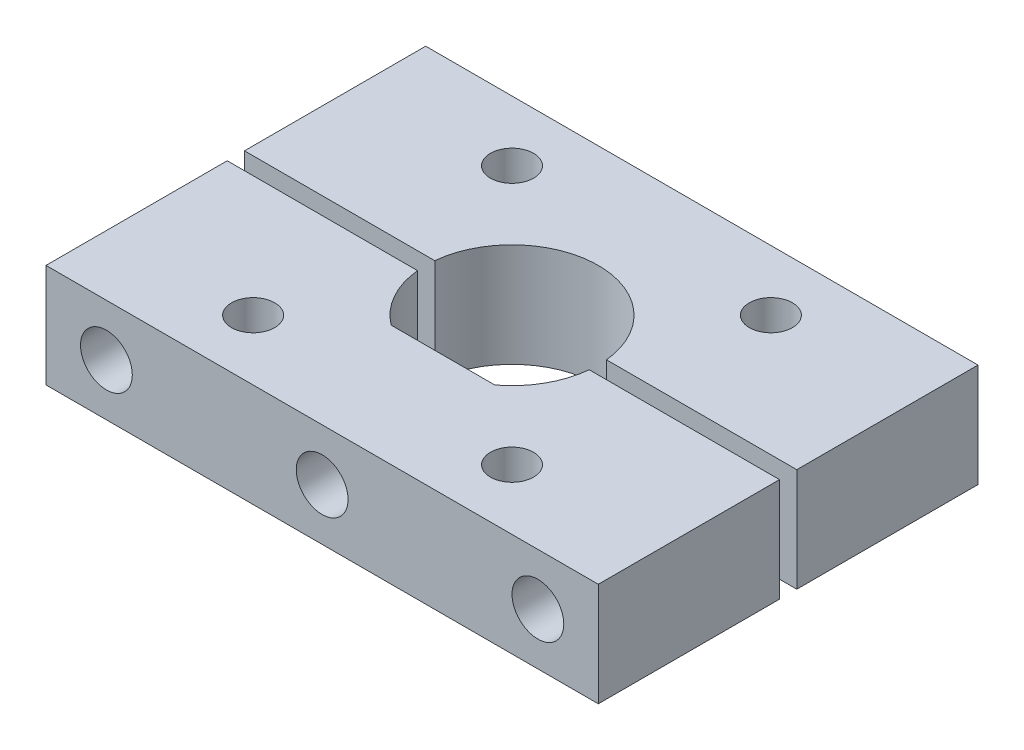
ISO-10303-21;
HEADER;
FILE_DESCRIPTION(('STEP AP214'),'2;1');
FILE_NAME('part.step','',(''),(''),'','','');
FILE_SCHEMA(('AUTOMOTIVE_DESIGN { 1 0 10303 214 1 1 1 1 }'));
ENDSEC;
DATA;
#1=APPLICATION_CONTEXT('core data for automotive mechanical design processes');
#2=APPLICATION_PROTOCOL_DEFINITION('international standard','automotive_design',2000,#1);
#3=PRODUCT_CONTEXT('',#1,'mechanical');
#4=PRODUCT('Part','Part','',(#3));
#5=PRODUCT_RELATED_PRODUCT_CATEGORY('part','',(#4));
#6=PRODUCT_DEFINITION_FORMATION('','',#4);
#7=PRODUCT_DEFINITION_CONTEXT('part definition',#1,'design');
#8=PRODUCT_DEFINITION('design','',#6,#7);
#9=PRODUCT_DEFINITION_SHAPE('','',#8);
#10=(LENGTH_UNIT() NAMED_UNIT(*) SI_UNIT(.MILLI.,.METRE.));
#11=(NAMED_UNIT(*) PLANE_ANGLE_UNIT() SI_UNIT($,.RADIAN.));
#12=(NAMED_UNIT(*) SI_UNIT($,.STERADIAN.) SOLID_ANGLE_UNIT());
#13=UNCERTAINTY_MEASURE_WITH_UNIT(LENGTH_MEASURE(1.E-05),#10,'distance_accuracy_value','');
#14=(GEOMETRIC_REPRESENTATION_CONTEXT(3) GLOBAL_UNCERTAINTY_ASSIGNED_CONTEXT((#13)) GLOBAL_UNIT_ASSIGNED_CONTEXT((#10,
#11,#12)) REPRESENTATION_CONTEXT('',''));
#15=CARTESIAN_POINT('',(0.,0.,0.));
#16=DIRECTION('',(0.,0.,1.));
#17=DIRECTION('',(1.,0.,0.));
#18=AXIS2_PLACEMENT_3D('',#15,#16,#17);
#19=CARTESIAN_POINT('',(-16.,3.,0.499999999999999));
#20=DIRECTION('',(1.,0.,0.));
#21=DIRECTION('',(0.,0.,-1.));
#22=AXIS2_PLACEMENT_3D('',#19,#20,#21);
#23=PLANE('',#22);
#24=DIRECTION('',(0.,0.,1.));
#25=VECTOR('',#24,1.);
#26=CARTESIAN_POINT('',(-16.,-3.,0.499999999999999));
#27=LINE('',#26,#25);
#28=CARTESIAN_POINT('',(-16.,-3.,0.499999999999999));
#29=VERTEX_POINT('',#28);
#30=CARTESIAN_POINT('',(-16.,-3.,11.));
#31=VERTEX_POINT('',#30);
#32=EDGE_CURVE('E162',#29,#31,#27,.T.);
#33=ORIENTED_EDGE('',*,*,#32,.T.);
#34=DIRECTION('',(0.,-1.,0.));
#35=VECTOR('',#34,1.);
#36=CARTESIAN_POINT('',(-16.,3.,11.));
#37=LINE('',#36,#35);
#38=CARTESIAN_POINT('',(-16.,3.,11.));
#39=VERTEX_POINT('',#38);
#40=EDGE_CURVE('E14',#39,#31,#37,.T.);
#41=ORIENTED_EDGE('',*,*,#40,.F.);
#42=DIRECTION('',(0.,0.,1.));
#43=VECTOR('',#42,1.);
#44=CARTESIAN_POINT('',(-16.,3.,0.499999999999999));
#45=LINE('',#44,#43);
#46=CARTESIAN_POINT('',(-16.,3.,0.499999999999999));
#47=VERTEX_POINT('',#46);
#48=EDGE_CURVE('E177',#47,#39,#45,.T.);
#49=ORIENTED_EDGE('',*,*,#48,.F.);
#50=DIRECTION('',(0.,-1.,0.));
#51=VECTOR('',#50,1.);
#52=CARTESIAN_POINT('',(-16.,3.,0.499999999999999));
#53=LINE('',#52,#51);
#54=EDGE_CURVE('E158',#47,#29,#53,.T.);
#55=ORIENTED_EDGE('',*,*,#54,.T.);
#56=EDGE_LOOP('',(#33,#41,#49,#55));
#57=FACE_BOUND('',#56,.T.);
#58=ADVANCED_FACE('F64',(#57),#23,.F.);
#59=CARTESIAN_POINT('',(-16.,3.,11.));
#60=DIRECTION('',(0.,0.,-1.));
#61=DIRECTION('',(-1.,0.,0.));
#62=AXIS2_PLACEMENT_3D('',#59,#60,#61);
#63=PLANE('',#62);
#64=CARTESIAN_POINT('',(12.5,0.,11.));
#65=DIRECTION('',(0.,0.,1.));
#66=DIRECTION('',(1.,0.,0.));
#67=AXIS2_PLACEMENT_3D('',#64,#65,#66);
#68=CIRCLE('',#67,1.5);
#69=CARTESIAN_POINT('',(14.,0.,11.));
#70=VERTEX_POINT('',#69);
#71=EDGE_CURVE('E378',#70,#70,#68,.T.);
#72=ORIENTED_EDGE('',*,*,#71,.F.);
#73=EDGE_LOOP('',(#72));
#74=FACE_BOUND('',#73,.T.);
#75=CARTESIAN_POINT('',(-12.5,0.,11.));
#76=DIRECTION('',(0.,0.,1.));
#77=DIRECTION('',(1.,0.,0.));
#78=AXIS2_PLACEMENT_3D('',#75,#76,#77);
#79=CIRCLE('',#78,1.5);
#80=CARTESIAN_POINT('',(-11.,0.,11.));
#81=VERTEX_POINT('',#80);
#82=EDGE_CURVE('E379',#81,#81,#79,.T.);
#83=ORIENTED_EDGE('',*,*,#82,.F.);
#84=EDGE_LOOP('',(#83));
#85=FACE_BOUND('',#84,.T.);
#86=CARTESIAN_POINT('',(0.,0.,11.));
#87=DIRECTION('',(0.,0.,1.));
#88=DIRECTION('',(1.,0.,0.));
#89=AXIS2_PLACEMENT_3D('',#86,#87,#88);
#90=CIRCLE('',#89,1.5);
#91=CARTESIAN_POINT('',(1.5,0.,11.));
#92=VERTEX_POINT('',#91);
#93=EDGE_CURVE('E192',#92,#92,#90,.T.);
#94=ORIENTED_EDGE('',*,*,#93,.F.);
#95=EDGE_LOOP('',(#94));
#96=FACE_BOUND('',#95,.T.);
#97=DIRECTION('',(1.,0.,0.));
#98=VECTOR('',#97,1.);
#99=CARTESIAN_POINT('',(-16.,-3.,11.));
#100=LINE('',#99,#98);
#101=CARTESIAN_POINT('',(16.,-3.,11.));
#102=VERTEX_POINT('',#101);
#103=EDGE_CURVE('E165',#31,#102,#100,.T.);
#104=ORIENTED_EDGE('',*,*,#103,.T.);
#105=DIRECTION('',(0.,-1.,0.));
#106=VECTOR('',#105,1.);
#107=CARTESIAN_POINT('',(16.,3.,11.));
#108=LINE('',#107,#106);
#109=CARTESIAN_POINT('',(16.,3.,11.));
#110=VERTEX_POINT('',#109);
#111=EDGE_CURVE('E73',#110,#102,#108,.T.);
#112=ORIENTED_EDGE('',*,*,#111,.F.);
#113=DIRECTION('',(1.,0.,0.));
#114=VECTOR('',#113,1.);
#115=CARTESIAN_POINT('',(-16.,3.,11.));
#116=LINE('',#115,#114);
#117=EDGE_CURVE('E125',#39,#110,#116,.T.);
#118=ORIENTED_EDGE('',*,*,#117,.F.);
#119=ORIENTED_EDGE('',*,*,#40,.T.);
#120=EDGE_LOOP('',(#104,#112,#118,#119));
#121=FACE_BOUND('',#120,.T.);
#122=ADVANCED_FACE('F250',(#74,#85,#96,#121),#63,.F.);
#123=CARTESIAN_POINT('',(16.,3.,0.499999999999999));
#124=DIRECTION('',(-1.,0.,0.));
#125=DIRECTION('',(0.,0.,1.));
#126=AXIS2_PLACEMENT_3D('',#123,#124,#125);
#127=PLANE('',#126);
#128=DIRECTION('',(0.,0.,-1.));
#129=VECTOR('',#128,1.);
#130=CARTESIAN_POINT('',(16.,-3.,0.499999999999999));
#131=LINE('',#130,#129);
#132=CARTESIAN_POINT('',(16.,-3.,0.499999999999999));
#133=VERTEX_POINT('',#132);
#134=EDGE_CURVE('E168',#102,#133,#131,.T.);
#135=ORIENTED_EDGE('',*,*,#134,.T.);
#136=DIRECTION('',(0.,-1.,0.));
#137=VECTOR('',#136,1.);
#138=CARTESIAN_POINT('',(16.,3.,0.499999999999999));
#139=LINE('',#138,#137);
#140=CARTESIAN_POINT('',(16.,3.,0.499999999999999));
#141=VERTEX_POINT('',#140);
#142=EDGE_CURVE('E184',#141,#133,#139,.T.);
#143=ORIENTED_EDGE('',*,*,#142,.F.);
#144=DIRECTION('',(0.,0.,-1.));
#145=VECTOR('',#144,1.);
#146=CARTESIAN_POINT('',(16.,3.,0.499999999999999));
#147=LINE('',#146,#145);
#148=EDGE_CURVE('E217',#110,#141,#147,.T.);
#149=ORIENTED_EDGE('',*,*,#148,.F.);
#150=ORIENTED_EDGE('',*,*,#111,.T.);
#151=EDGE_LOOP('',(#135,#143,#149,#150));
#152=FACE_BOUND('',#151,.T.);
#153=ADVANCED_FACE('F254',(#152),#127,.F.);
#154=CARTESIAN_POINT('',(16.,3.,0.499999999999999));
#155=DIRECTION('',(0.,0.,1.));
#156=DIRECTION('',(1.,0.,0.));
#157=AXIS2_PLACEMENT_3D('',#154,#155,#156);
#158=PLANE('',#157);
#159=CARTESIAN_POINT('',(12.5,0.,0.499999999999999));
#160=DIRECTION('',(0.,0.,1.));
#161=DIRECTION('',(1.,0.,0.));
#162=AXIS2_PLACEMENT_3D('',#159,#160,#161);
#163=CIRCLE('',#162,1.5);
#164=CARTESIAN_POINT('',(14.,0.,0.499999999999999));
#165=VERTEX_POINT('',#164);
#166=EDGE_CURVE('E67',#165,#165,#163,.T.);
#167=ORIENTED_EDGE('',*,*,#166,.T.);
#168=EDGE_LOOP('',(#167));
#169=FACE_BOUND('',#168,.T.);
#170=DIRECTION('',(-1.,0.,0.));
#171=VECTOR('',#170,1.);
#172=CARTESIAN_POINT('',(16.,-3.,0.499999999999999));
#173=LINE('',#172,#171);
#174=CARTESIAN_POINT('',(4.9749371855331,-3.,0.5));
#175=VERTEX_POINT('',#174);
#176=EDGE_CURVE('E170',#133,#175,#173,.T.);
#177=ORIENTED_EDGE('',*,*,#176,.T.);
#178=DIRECTION('',(0.,-1.,0.));
#179=VECTOR('',#178,1.);
#180=CARTESIAN_POINT('',(4.9749371855331,3.,0.5));
#181=LINE('',#180,#179);
#182=CARTESIAN_POINT('',(4.9749371855331,3.,0.5));
#183=VERTEX_POINT('',#182);
#184=EDGE_CURVE('E181',#183,#175,#181,.T.);
#185=ORIENTED_EDGE('',*,*,#184,.F.);
#186=DIRECTION('',(-1.,0.,0.));
#187=VECTOR('',#186,1.);
#188=CARTESIAN_POINT('',(16.,3.,0.499999999999999));
#189=LINE('',#188,#187);
#190=EDGE_CURVE('E219',#141,#183,#189,.T.);
#191=ORIENTED_EDGE('',*,*,#190,.F.);
#192=ORIENTED_EDGE('',*,*,#142,.T.);
#193=EDGE_LOOP('',(#177,#185,#191,#192));
#194=FACE_BOUND('',#193,.T.);
#195=ADVANCED_FACE('F225',(#169,#194),#158,.F.);
#196=CARTESIAN_POINT('',(0.,3.,0.));
#197=DIRECTION('',(0.,-1.,0.));
#198=DIRECTION('',(0.,0.,-1.));
#199=AXIS2_PLACEMENT_3D('',#196,#197,#198);
#200=CYLINDRICAL_SURFACE('',#199,5.);
#201=CARTESIAN_POINT('',(0.,-3.,0.));
#202=DIRECTION('',(0.,-1.,0.));
#203=DIRECTION('',(0.,0.,-1.));
#204=AXIS2_PLACEMENT_3D('',#201,#202,#203);
#205=CIRCLE('',#204,5.);
#206=CARTESIAN_POINT('',(3.,-3.,4.));
#207=VERTEX_POINT('',#206);
#208=EDGE_CURVE('E172',#175,#207,#205,.T.);
#209=ORIENTED_EDGE('',*,*,#208,.T.);
#210=DIRECTION('',(0.,-1.,0.));
#211=VECTOR('',#210,1.);
#212=CARTESIAN_POINT('',(3.,3.,4.));
#213=LINE('',#212,#211);
#214=CARTESIAN_POINT('',(3.,3.,4.));
#215=VERTEX_POINT('',#214);
#216=EDGE_CURVE('E153',#215,#207,#213,.T.);
#217=ORIENTED_EDGE('',*,*,#216,.F.);
#218=CARTESIAN_POINT('',(0.,3.,0.));
#219=DIRECTION('',(0.,-1.,0.));
#220=DIRECTION('',(0.,0.,-1.));
#221=AXIS2_PLACEMENT_3D('',#218,#219,#220);
#222=CIRCLE('',#221,5.);
#223=EDGE_CURVE('E144',#183,#215,#222,.T.);
#224=ORIENTED_EDGE('',*,*,#223,.F.);
#225=ORIENTED_EDGE('',*,*,#184,.T.);
#226=EDGE_LOOP('',(#209,#217,#224,#225));
#227=FACE_BOUND('',#226,.T.);
#228=ADVANCED_FACE('F229',(#227),#200,.F.);
#229=CARTESIAN_POINT('',(-3.,3.,4.));
#230=DIRECTION('',(0.,0.,1.));
#231=DIRECTION('',(1.,0.,0.));
#232=AXIS2_PLACEMENT_3D('',#229,#230,#231);
#233=PLANE('',#232);
#234=CARTESIAN_POINT('',(0.,0.,4.));
#235=DIRECTION('',(0.,0.,1.));
#236=DIRECTION('',(1.,0.,0.));
#237=AXIS2_PLACEMENT_3D('',#234,#235,#236);
#238=CIRCLE('',#237,1.5);
#239=CARTESIAN_POINT('',(1.5,0.,4.));
#240=VERTEX_POINT('',#239);
#241=EDGE_CURVE('E191',#240,#240,#238,.T.);
#242=ORIENTED_EDGE('',*,*,#241,.T.);
#243=EDGE_LOOP('',(#242));
#244=FACE_BOUND('',#243,.T.);
#245=DIRECTION('',(-1.,0.,0.));
#246=VECTOR('',#245,1.);
#247=CARTESIAN_POINT('',(-3.,-3.,4.));
#248=LINE('',#247,#246);
#249=CARTESIAN_POINT('',(-3.,-3.,4.));
#250=VERTEX_POINT('',#249);
#251=EDGE_CURVE('E152',#207,#250,#248,.T.);
#252=ORIENTED_EDGE('',*,*,#251,.T.);
#253=DIRECTION('',(0.,-1.,0.));
#254=VECTOR('',#253,1.);
#255=CARTESIAN_POINT('',(-3.,3.,4.));
#256=LINE('',#255,#254);
#257=CARTESIAN_POINT('',(-3.,3.,4.));
#258=VERTEX_POINT('',#257);
#259=EDGE_CURVE('E149',#258,#250,#256,.T.);
#260=ORIENTED_EDGE('',*,*,#259,.F.);
#261=DIRECTION('',(-1.,0.,0.));
#262=VECTOR('',#261,1.);
#263=CARTESIAN_POINT('',(-3.,3.,4.));
#264=LINE('',#263,#262);
#265=EDGE_CURVE('E138',#215,#258,#264,.T.);
#266=ORIENTED_EDGE('',*,*,#265,.F.);
#267=ORIENTED_EDGE('',*,*,#216,.T.);
#268=EDGE_LOOP('',(#252,#260,#266,#267));
#269=FACE_BOUND('',#268,.T.);
#270=ADVANCED_FACE('F150',(#244,#269),#233,.F.);
#271=CARTESIAN_POINT('',(0.,3.,0.));
#272=DIRECTION('',(0.,-1.,0.));
#273=DIRECTION('',(0.,0.,-1.));
#274=AXIS2_PLACEMENT_3D('',#271,#272,#273);
#275=CYLINDRICAL_SURFACE('',#274,5.);
#276=CARTESIAN_POINT('',(0.,-3.,0.));
#277=DIRECTION('',(0.,-1.,0.));
#278=DIRECTION('',(0.,0.,1.));
#279=AXIS2_PLACEMENT_3D('',#276,#277,#278);
#280=CIRCLE('',#279,5.);
#281=CARTESIAN_POINT('',(-4.9749371855331,-3.,0.499999999999999));
#282=VERTEX_POINT('',#281);
#283=EDGE_CURVE('E111',#250,#282,#280,.T.);
#284=ORIENTED_EDGE('',*,*,#283,.T.);
#285=DIRECTION('',(0.,-1.,0.));
#286=VECTOR('',#285,1.);
#287=CARTESIAN_POINT('',(-4.9749371855331,3.,0.499999999999999));
#288=LINE('',#287,#286);
#289=CARTESIAN_POINT('',(-4.9749371855331,3.,0.499999999999999));
#290=VERTEX_POINT('',#289);
#291=EDGE_CURVE('E154',#290,#282,#288,.T.);
#292=ORIENTED_EDGE('',*,*,#291,.F.);
#293=CARTESIAN_POINT('',(0.,3.,0.));
#294=DIRECTION('',(0.,-1.,0.));
#295=DIRECTION('',(0.,0.,1.));
#296=AXIS2_PLACEMENT_3D('',#293,#294,#295);
#297=CIRCLE('',#296,5.);
#298=EDGE_CURVE('E142',#258,#290,#297,.T.);
#299=ORIENTED_EDGE('',*,*,#298,.F.);
#300=ORIENTED_EDGE('',*,*,#259,.T.);
#301=EDGE_LOOP('',(#284,#292,#299,#300));
#302=FACE_BOUND('',#301,.T.);
#303=ADVANCED_FACE('F156',(#302),#275,.F.);
#304=CARTESIAN_POINT('',(-16.,3.,0.499999999999999));
#305=DIRECTION('',(0.,0.,1.));
#306=DIRECTION('',(1.,0.,0.));
#307=AXIS2_PLACEMENT_3D('',#304,#305,#306);
#308=PLANE('',#307);
#309=CARTESIAN_POINT('',(-12.5,0.,0.499999999999999));
#310=DIRECTION('',(0.,0.,1.));
#311=DIRECTION('',(1.,0.,0.));
#312=AXIS2_PLACEMENT_3D('',#309,#310,#311);
#313=CIRCLE('',#312,1.5);
#314=CARTESIAN_POINT('',(-11.,0.,0.499999999999999));
#315=VERTEX_POINT('',#314);
#316=EDGE_CURVE('E189',#315,#315,#313,.T.);
#317=ORIENTED_EDGE('',*,*,#316,.T.);
#318=EDGE_LOOP('',(#317));
#319=FACE_BOUND('',#318,.T.);
#320=DIRECTION('',(-1.,0.,0.));
#321=VECTOR('',#320,1.);
#322=CARTESIAN_POINT('',(-16.,-3.,0.499999999999999));
#323=LINE('',#322,#321);
#324=EDGE_CURVE('E117',#282,#29,#323,.T.);
#325=ORIENTED_EDGE('',*,*,#324,.T.);
#326=ORIENTED_EDGE('',*,*,#54,.F.);
#327=DIRECTION('',(-1.,0.,0.));
#328=VECTOR('',#327,1.);
#329=CARTESIAN_POINT('',(-16.,3.,0.499999999999999));
#330=LINE('',#329,#328);
#331=EDGE_CURVE('E82',#290,#47,#330,.T.);
#332=ORIENTED_EDGE('',*,*,#331,.F.);
#333=ORIENTED_EDGE('',*,*,#291,.T.);
#334=EDGE_LOOP('',(#325,#326,#332,#333));
#335=FACE_BOUND('',#334,.T.);
#336=ADVANCED_FACE('F237',(#319,#335),#308,.F.);
#337=CARTESIAN_POINT('',(0.,3.,0.));
#338=DIRECTION('',(0.,-1.,0.));
#339=DIRECTION('',(0.,0.,-1.));
#340=AXIS2_PLACEMENT_3D('',#337,#338,#339);
#341=PLANE('',#340);
#342=CARTESIAN_POINT('',(-7.5,3.,7.5));
#343=DIRECTION('',(0.,1.,0.));
#344=DIRECTION('',(0.,0.,1.));
#345=AXIS2_PLACEMENT_3D('',#342,#343,#344);
#346=CIRCLE('',#345,1.24999999999999);
#347=CARTESIAN_POINT('',(-7.5,3.,8.74999999999999));
#348=VERTEX_POINT('',#347);
#349=EDGE_CURVE('E197',#348,#348,#346,.T.);
#350=ORIENTED_EDGE('',*,*,#349,.F.);
#351=EDGE_LOOP('',(#350));
#352=FACE_BOUND('',#351,.T.);
#353=CARTESIAN_POINT('',(7.5,3.,7.5));
#354=DIRECTION('',(0.,1.,0.));
#355=DIRECTION('',(0.,0.,1.));
#356=AXIS2_PLACEMENT_3D('',#353,#354,#355);
#357=CIRCLE('',#356,1.24999999999999);
#358=CARTESIAN_POINT('',(7.5,3.,8.74999999999999));
#359=VERTEX_POINT('',#358);
#360=EDGE_CURVE('E206',#359,#359,#357,.T.);
#361=ORIENTED_EDGE('',*,*,#360,.F.);
#362=EDGE_LOOP('',(#361));
#363=FACE_BOUND('',#362,.T.);
#364=ORIENTED_EDGE('',*,*,#48,.T.);
#365=ORIENTED_EDGE('',*,*,#117,.T.);
#366=ORIENTED_EDGE('',*,*,#148,.T.);
#367=ORIENTED_EDGE('',*,*,#190,.T.);
#368=ORIENTED_EDGE('',*,*,#223,.T.);
#369=ORIENTED_EDGE('',*,*,#265,.T.);
#370=ORIENTED_EDGE('',*,*,#298,.T.);
#371=ORIENTED_EDGE('',*,*,#331,.T.);
#372=EDGE_LOOP('',(#364,#365,#366,#367,#368,#369,#370,#371));
#373=FACE_BOUND('',#372,.T.);
#374=ADVANCED_FACE('F140',(#352,#363,#373),#341,.F.);
#375=CARTESIAN_POINT('',(0.,-3.,0.));
#376=DIRECTION('',(0.,-1.,0.));
#377=DIRECTION('',(0.,0.,-1.));
#378=AXIS2_PLACEMENT_3D('',#375,#376,#377);
#379=PLANE('',#378);
#380=CARTESIAN_POINT('',(-7.5,-3.,7.5));
#381=DIRECTION('',(0.,1.,0.));
#382=DIRECTION('',(0.,0.,1.));
#383=AXIS2_PLACEMENT_3D('',#380,#381,#382);
#384=CIRCLE('',#383,1.25);
#385=CARTESIAN_POINT('',(-7.5,-3.,8.75));
#386=VERTEX_POINT('',#385);
#387=EDGE_CURVE('E201',#386,#386,#384,.T.);
#388=ORIENTED_EDGE('',*,*,#387,.T.);
#389=EDGE_LOOP('',(#388));
#390=FACE_BOUND('',#389,.T.);
#391=CARTESIAN_POINT('',(7.5,-3.,7.5));
#392=DIRECTION('',(0.,1.,0.));
#393=DIRECTION('',(0.,0.,1.));
#394=AXIS2_PLACEMENT_3D('',#391,#392,#393);
#395=CIRCLE('',#394,1.25);
#396=CARTESIAN_POINT('',(7.5,-3.,8.75));
#397=VERTEX_POINT('',#396);
#398=EDGE_CURVE('E166',#397,#397,#395,.T.);
#399=ORIENTED_EDGE('',*,*,#398,.T.);
#400=EDGE_LOOP('',(#399));
#401=FACE_BOUND('',#400,.T.);
#402=ORIENTED_EDGE('',*,*,#32,.F.);
#403=ORIENTED_EDGE('',*,*,#324,.F.);
#404=ORIENTED_EDGE('',*,*,#283,.F.);
#405=ORIENTED_EDGE('',*,*,#251,.F.);
#406=ORIENTED_EDGE('',*,*,#208,.F.);
#407=ORIENTED_EDGE('',*,*,#176,.F.);
#408=ORIENTED_EDGE('',*,*,#134,.F.);
#409=ORIENTED_EDGE('',*,*,#103,.F.);
#410=EDGE_LOOP('',(#402,#403,#404,#405,#406,#407,#408,#409));
#411=FACE_BOUND('',#410,.T.);
#412=ADVANCED_FACE('F232',(#390,#401,#411),#379,.T.);
#413=CARTESIAN_POINT('',(7.5,3.,7.5));
#414=DIRECTION('',(0.,1.,0.));
#415=DIRECTION('',(0.,0.,1.));
#416=AXIS2_PLACEMENT_3D('',#413,#414,#415);
#417=CYLINDRICAL_SURFACE('',#416,1.24999999999999);
#418=ORIENTED_EDGE('',*,*,#398,.F.);
#419=EDGE_LOOP('',(#418));
#420=FACE_BOUND('',#419,.T.);
#421=ORIENTED_EDGE('',*,*,#360,.T.);
#422=EDGE_LOOP('',(#421));
#423=FACE_BOUND('',#422,.T.);
#424=ADVANCED_FACE('F297',(#420,#423),#417,.F.);
#425=CARTESIAN_POINT('',(-7.5,3.,7.5));
#426=DIRECTION('',(0.,1.,0.));
#427=DIRECTION('',(0.,0.,1.));
#428=AXIS2_PLACEMENT_3D('',#425,#426,#427);
#429=CYLINDRICAL_SURFACE('',#428,1.24999999999999);
#430=ORIENTED_EDGE('',*,*,#387,.F.);
#431=EDGE_LOOP('',(#430));
#432=FACE_BOUND('',#431,.T.);
#433=ORIENTED_EDGE('',*,*,#349,.T.);
#434=EDGE_LOOP('',(#433));
#435=FACE_BOUND('',#434,.T.);
#436=ADVANCED_FACE('F307',(#432,#435),#429,.F.);
#437=CARTESIAN_POINT('',(-12.5,0.,-11.));
#438=DIRECTION('',(0.,0.,1.));
#439=DIRECTION('',(1.,0.,0.));
#440=AXIS2_PLACEMENT_3D('',#437,#438,#439);
#441=CYLINDRICAL_SURFACE('',#440,1.5);
#442=ORIENTED_EDGE('',*,*,#82,.T.);
#443=EDGE_LOOP('',(#442));
#444=FACE_BOUND('',#443,.T.);
#445=ORIENTED_EDGE('',*,*,#316,.F.);
#446=EDGE_LOOP('',(#445));
#447=FACE_BOUND('',#446,.T.);
#448=ADVANCED_FACE('F317',(#444,#447),#441,.F.);
#449=CARTESIAN_POINT('',(0.,0.,-11.));
#450=DIRECTION('',(0.,0.,1.));
#451=DIRECTION('',(1.,0.,0.));
#452=AXIS2_PLACEMENT_3D('',#449,#450,#451);
#453=CYLINDRICAL_SURFACE('',#452,1.5);
#454=ORIENTED_EDGE('',*,*,#93,.T.);
#455=EDGE_LOOP('',(#454));
#456=FACE_BOUND('',#455,.T.);
#457=ORIENTED_EDGE('',*,*,#241,.F.);
#458=EDGE_LOOP('',(#457));
#459=FACE_BOUND('',#458,.T.);
#460=ADVANCED_FACE('F352',(#456,#459),#453,.F.);
#461=CARTESIAN_POINT('',(12.5,0.,-11.));
#462=DIRECTION('',(0.,0.,1.));
#463=DIRECTION('',(1.,0.,0.));
#464=AXIS2_PLACEMENT_3D('',#461,#462,#463);
#465=CYLINDRICAL_SURFACE('',#464,1.5);
#466=ORIENTED_EDGE('',*,*,#71,.T.);
#467=EDGE_LOOP('',(#466));
#468=FACE_BOUND('',#467,.T.);
#469=ORIENTED_EDGE('',*,*,#166,.F.);
#470=EDGE_LOOP('',(#469));
#471=FACE_BOUND('',#470,.T.);
#472=ADVANCED_FACE('F359',(#468,#471),#465,.F.);
#473=CLOSED_SHELL('',(#58,#122,#153,#195,#228,#270,#303,#336,#374,#412,#424,#436,#448,#460,#472));
#474=MANIFOLD_SOLID_BREP('B2',#473);
#475=CARTESIAN_POINT('',(-16.,3.,-11.));
#476=DIRECTION('',(1.,0.,0.));
#477=DIRECTION('',(0.,0.,-1.));
#478=AXIS2_PLACEMENT_3D('',#475,#476,#477);
#479=PLANE('',#478);
#480=DIRECTION('',(0.,0.,1.));
#481=VECTOR('',#480,1.);
#482=CARTESIAN_POINT('',(-16.,-3.,-11.));
#483=LINE('',#482,#481);
#484=CARTESIAN_POINT('',(-16.,-3.,-11.));
#485=VERTEX_POINT('',#484);
#486=CARTESIAN_POINT('',(-16.,-3.,-0.499999999999999));
#487=VERTEX_POINT('',#486);
#488=EDGE_CURVE('E495',#485,#487,#483,.T.);
#489=ORIENTED_EDGE('',*,*,#488,.T.);
#490=DIRECTION('',(0.,-1.,0.));
#491=VECTOR('',#490,1.);
#492=CARTESIAN_POINT('',(-16.,3.,-0.499999999999999));
#493=LINE('',#492,#491);
#494=CARTESIAN_POINT('',(-16.,3.,-0.499999999999999));
#495=VERTEX_POINT('',#494);
#496=EDGE_CURVE('E62',#495,#487,#493,.T.);
#497=ORIENTED_EDGE('',*,*,#496,.F.);
#498=DIRECTION('',(0.,0.,1.));
#499=VECTOR('',#498,1.);
#500=CARTESIAN_POINT('',(-16.,3.,-11.));
#501=LINE('',#500,#499);
#502=CARTESIAN_POINT('',(-16.,3.,-11.));
#503=VERTEX_POINT('',#502);
#504=EDGE_CURVE('E512',#503,#495,#501,.T.);
#505=ORIENTED_EDGE('',*,*,#504,.F.);
#506=DIRECTION('',(0.,-1.,0.));
#507=VECTOR('',#506,1.);
#508=CARTESIAN_POINT('',(-16.,3.,-11.));
#509=LINE('',#508,#507);
#510=EDGE_CURVE('E491',#503,#485,#509,.T.);
#511=ORIENTED_EDGE('',*,*,#510,.T.);
#512=EDGE_LOOP('',(#489,#497,#505,#511));
#513=FACE_BOUND('',#512,.T.);
#514=ADVANCED_FACE('F406',(#513),#479,.F.);
#515=CARTESIAN_POINT('',(-4.9749371855331,3.,-0.5));
#516=DIRECTION('',(0.,0.,-1.));
#517=DIRECTION('',(-1.,0.,0.));
#518=AXIS2_PLACEMENT_3D('',#515,#516,#517);
#519=PLANE('',#518);
#520=CARTESIAN_POINT('',(-12.5,0.,-0.5));
#521=DIRECTION('',(0.,0.,-1.));
#522=DIRECTION('',(-1.,0.,0.));
#523=AXIS2_PLACEMENT_3D('',#520,#521,#522);
#524=CIRCLE('',#523,1.24999999999999);
#525=CARTESIAN_POINT('',(-13.75,0.,-0.5));
#526=VERTEX_POINT('',#525);
#527=EDGE_CURVE('E567',#526,#526,#524,.T.);
#528=ORIENTED_EDGE('',*,*,#527,.T.);
#529=EDGE_LOOP('',(#528));
#530=FACE_BOUND('',#529,.T.);
#531=DIRECTION('',(1.,0.,0.));
#532=VECTOR('',#531,1.);
#533=CARTESIAN_POINT('',(-4.9749371855331,-3.,-0.5));
#534=LINE('',#533,#532);
#535=CARTESIAN_POINT('',(-4.9749371855331,-3.,-0.500000000000001));
#536=VERTEX_POINT('',#535);
#537=EDGE_CURVE('E499',#487,#536,#534,.T.);
#538=ORIENTED_EDGE('',*,*,#537,.T.);
#539=DIRECTION('',(0.,-1.,0.));
#540=VECTOR('',#539,1.);
#541=CARTESIAN_POINT('',(-4.9749371855331,3.,-0.500000000000001));
#542=LINE('',#541,#540);
#543=CARTESIAN_POINT('',(-4.9749371855331,3.,-0.500000000000001));
#544=VERTEX_POINT('',#543);
#545=EDGE_CURVE('E415',#544,#536,#542,.T.);
#546=ORIENTED_EDGE('',*,*,#545,.F.);
#547=DIRECTION('',(1.,0.,0.));
#548=VECTOR('',#547,1.);
#549=CARTESIAN_POINT('',(-4.9749371855331,3.,-0.5));
#550=LINE('',#549,#548);
#551=EDGE_CURVE('E460',#495,#544,#550,.T.);
#552=ORIENTED_EDGE('',*,*,#551,.F.);
#553=ORIENTED_EDGE('',*,*,#496,.T.);
#554=EDGE_LOOP('',(#538,#546,#552,#553));
#555=FACE_BOUND('',#554,.T.);
#556=ADVANCED_FACE('F544',(#530,#555),#519,.F.);
#557=CARTESIAN_POINT('',(0.,3.,0.));
#558=DIRECTION('',(0.,-1.,0.));
#559=DIRECTION('',(0.,0.,-1.));
#560=AXIS2_PLACEMENT_3D('',#557,#558,#559);
#561=CYLINDRICAL_SURFACE('',#560,5.);
#562=CARTESIAN_POINT('',(0.,-3.,0.));
#563=DIRECTION('',(0.,-1.,0.));
#564=DIRECTION('',(0.,0.,1.));
#565=AXIS2_PLACEMENT_3D('',#562,#563,#564);
#566=CIRCLE('',#565,5.);
#567=CARTESIAN_POINT('',(4.9749371855331,-3.,-0.5));
#568=VERTEX_POINT('',#567);
#569=EDGE_CURVE('E503',#536,#568,#566,.T.);
#570=ORIENTED_EDGE('',*,*,#569,.T.);
#571=DIRECTION('',(0.,-1.,0.));
#572=VECTOR('',#571,1.);
#573=CARTESIAN_POINT('',(4.9749371855331,3.,-0.5));
#574=LINE('',#573,#572);
#575=CARTESIAN_POINT('',(4.9749371855331,3.,-0.5));
#576=VERTEX_POINT('',#575);
#577=EDGE_CURVE('E484',#576,#568,#574,.T.);
#578=ORIENTED_EDGE('',*,*,#577,.F.);
#579=CARTESIAN_POINT('',(0.,3.,0.));
#580=DIRECTION('',(0.,-1.,0.));
#581=DIRECTION('',(0.,0.,1.));
#582=AXIS2_PLACEMENT_3D('',#579,#580,#581);
#583=CIRCLE('',#582,5.);
#584=EDGE_CURVE('E473',#544,#576,#583,.T.);
#585=ORIENTED_EDGE('',*,*,#584,.F.);
#586=ORIENTED_EDGE('',*,*,#545,.T.);
#587=EDGE_LOOP('',(#570,#578,#585,#586));
#588=FACE_BOUND('',#587,.T.);
#589=ADVANCED_FACE('F522',(#588),#561,.F.);
#590=CARTESIAN_POINT('',(4.9749371855331,3.,-0.5));
#591=DIRECTION('',(0.,0.,-1.));
#592=DIRECTION('',(-1.,0.,0.));
#593=AXIS2_PLACEMENT_3D('',#590,#591,#592);
#594=PLANE('',#593);
#595=CARTESIAN_POINT('',(12.5,0.,-0.5));
#596=DIRECTION('',(0.,0.,-1.));
#597=DIRECTION('',(-1.,0.,0.));
#598=AXIS2_PLACEMENT_3D('',#595,#596,#597);
#599=CIRCLE('',#598,1.24999999999999);
#600=CARTESIAN_POINT('',(11.25,0.,-0.500000000000001));
#601=VERTEX_POINT('',#600);
#602=EDGE_CURVE('E500',#601,#601,#599,.T.);
#603=ORIENTED_EDGE('',*,*,#602,.T.);
#604=EDGE_LOOP('',(#603));
#605=FACE_BOUND('',#604,.T.);
#606=DIRECTION('',(1.,0.,0.));
#607=VECTOR('',#606,1.);
#608=CARTESIAN_POINT('',(4.9749371855331,-3.,-0.5));
#609=LINE('',#608,#607);
#610=CARTESIAN_POINT('',(16.,-3.,-0.499999999999999));
#611=VERTEX_POINT('',#610);
#612=EDGE_CURVE('E482',#568,#611,#609,.T.);
#613=ORIENTED_EDGE('',*,*,#612,.T.);
#614=DIRECTION('',(0.,-1.,0.));
#615=VECTOR('',#614,1.);
#616=CARTESIAN_POINT('',(16.,3.,-0.499999999999999));
#617=LINE('',#616,#615);
#618=CARTESIAN_POINT('',(16.,3.,-0.499999999999999));
#619=VERTEX_POINT('',#618);
#620=EDGE_CURVE('E479',#619,#611,#617,.T.);
#621=ORIENTED_EDGE('',*,*,#620,.F.);
#622=DIRECTION('',(1.,0.,0.));
#623=VECTOR('',#622,1.);
#624=CARTESIAN_POINT('',(4.9749371855331,3.,-0.5));
#625=LINE('',#624,#623);
#626=EDGE_CURVE('E467',#576,#619,#625,.T.);
#627=ORIENTED_EDGE('',*,*,#626,.F.);
#628=ORIENTED_EDGE('',*,*,#577,.T.);
#629=EDGE_LOOP('',(#613,#621,#627,#628));
#630=FACE_BOUND('',#629,.T.);
#631=ADVANCED_FACE('F480',(#605,#630),#594,.F.);
#632=CARTESIAN_POINT('',(16.,3.,-11.));
#633=DIRECTION('',(-1.,0.,0.));
#634=DIRECTION('',(0.,0.,1.));
#635=AXIS2_PLACEMENT_3D('',#632,#633,#634);
#636=PLANE('',#635);
#637=DIRECTION('',(0.,0.,-1.));
#638=VECTOR('',#637,1.);
#639=CARTESIAN_POINT('',(16.,-3.,-11.));
#640=LINE('',#639,#638);
#641=CARTESIAN_POINT('',(16.,-3.,-11.));
#642=VERTEX_POINT('',#641);
#643=EDGE_CURVE('E446',#611,#642,#640,.T.);
#644=ORIENTED_EDGE('',*,*,#643,.T.);
#645=DIRECTION('',(0.,-1.,0.));
#646=VECTOR('',#645,1.);
#647=CARTESIAN_POINT('',(16.,3.,-11.));
#648=LINE('',#647,#646);
#649=CARTESIAN_POINT('',(16.,3.,-11.));
#650=VERTEX_POINT('',#649);
#651=EDGE_CURVE('E485',#650,#642,#648,.T.);
#652=ORIENTED_EDGE('',*,*,#651,.F.);
#653=DIRECTION('',(0.,0.,-1.));
#654=VECTOR('',#653,1.);
#655=CARTESIAN_POINT('',(16.,3.,-11.));
#656=LINE('',#655,#654);
#657=EDGE_CURVE('E471',#619,#650,#656,.T.);
#658=ORIENTED_EDGE('',*,*,#657,.F.);
#659=ORIENTED_EDGE('',*,*,#620,.T.);
#660=EDGE_LOOP('',(#644,#652,#658,#659));
#661=FACE_BOUND('',#660,.T.);
#662=ADVANCED_FACE('F487',(#661),#636,.F.);
#663=CARTESIAN_POINT('',(-16.,3.,-11.));
#664=DIRECTION('',(0.,0.,1.));
#665=DIRECTION('',(1.,0.,0.));
#666=AXIS2_PLACEMENT_3D('',#663,#664,#665);
#667=PLANE('',#666);
#668=CARTESIAN_POINT('',(-12.5,0.,-11.));
#669=DIRECTION('',(0.,0.,1.));
#670=DIRECTION('',(1.,0.,0.));
#671=AXIS2_PLACEMENT_3D('',#668,#669,#670);
#672=CIRCLE('',#671,1.25);
#673=CARTESIAN_POINT('',(-11.25,0.,-11.));
#674=VERTEX_POINT('',#673);
#675=EDGE_CURVE('E577',#674,#674,#672,.T.);
#676=ORIENTED_EDGE('',*,*,#675,.T.);
#677=EDGE_LOOP('',(#676));
#678=FACE_BOUND('',#677,.T.);
#679=CARTESIAN_POINT('',(12.5,0.,-11.));
#680=DIRECTION('',(0.,0.,1.));
#681=DIRECTION('',(1.,0.,0.));
#682=AXIS2_PLACEMENT_3D('',#679,#680,#681);
#683=CIRCLE('',#682,1.25);
#684=CARTESIAN_POINT('',(13.75,0.,-11.));
#685=VERTEX_POINT('',#684);
#686=EDGE_CURVE('E563',#685,#685,#683,.T.);
#687=ORIENTED_EDGE('',*,*,#686,.T.);
#688=EDGE_LOOP('',(#687));
#689=FACE_BOUND('',#688,.T.);
#690=DIRECTION('',(-1.,0.,0.));
#691=VECTOR('',#690,1.);
#692=CARTESIAN_POINT('',(-16.,-3.,-11.));
#693=LINE('',#692,#691);
#694=EDGE_CURVE('E452',#642,#485,#693,.T.);
#695=ORIENTED_EDGE('',*,*,#694,.T.);
#696=ORIENTED_EDGE('',*,*,#510,.F.);
#697=DIRECTION('',(-1.,0.,0.));
#698=VECTOR('',#697,1.);
#699=CARTESIAN_POINT('',(-16.,3.,-11.));
#700=LINE('',#699,#698);
#701=EDGE_CURVE('E423',#650,#503,#700,.T.);
#702=ORIENTED_EDGE('',*,*,#701,.F.);
#703=ORIENTED_EDGE('',*,*,#651,.T.);
#704=EDGE_LOOP('',(#695,#696,#702,#703));
#705=FACE_BOUND('',#704,.T.);
#706=ADVANCED_FACE('F529',(#678,#689,#705),#667,.F.);
#707=CARTESIAN_POINT('',(0.,3.,0.));
#708=DIRECTION('',(0.,1.,0.));
#709=DIRECTION('',(0.,0.,1.));
#710=AXIS2_PLACEMENT_3D('',#707,#708,#709);
#711=PLANE('',#710);
#712=CARTESIAN_POINT('',(-7.5,3.,-7.5));
#713=DIRECTION('',(0.,1.,0.));
#714=DIRECTION('',(0.,0.,1.));
#715=AXIS2_PLACEMENT_3D('',#712,#713,#714);
#716=CIRCLE('',#715,1.24999999999999);
#717=CARTESIAN_POINT('',(-7.5,3.,-6.25000000000001));
#718=VERTEX_POINT('',#717);
#719=EDGE_CURVE('E592',#718,#718,#716,.T.);
#720=ORIENTED_EDGE('',*,*,#719,.F.);
#721=EDGE_LOOP('',(#720));
#722=FACE_BOUND('',#721,.T.);
#723=CARTESIAN_POINT('',(7.5,3.,-7.5));
#724=DIRECTION('',(0.,1.,0.));
#725=DIRECTION('',(0.,0.,1.));
#726=AXIS2_PLACEMENT_3D('',#723,#724,#725);
#727=CIRCLE('',#726,1.24999999999999);
#728=CARTESIAN_POINT('',(7.5,3.,-6.25000000000001));
#729=VERTEX_POINT('',#728);
#730=EDGE_CURVE('E584',#729,#729,#727,.T.);
#731=ORIENTED_EDGE('',*,*,#730,.F.);
#732=EDGE_LOOP('',(#731));
#733=FACE_BOUND('',#732,.T.);
#734=ORIENTED_EDGE('',*,*,#504,.T.);
#735=ORIENTED_EDGE('',*,*,#551,.T.);
#736=ORIENTED_EDGE('',*,*,#584,.T.);
#737=ORIENTED_EDGE('',*,*,#626,.T.);
#738=ORIENTED_EDGE('',*,*,#657,.T.);
#739=ORIENTED_EDGE('',*,*,#701,.T.);
#740=EDGE_LOOP('',(#734,#735,#736,#737,#738,#739));
#741=FACE_BOUND('',#740,.T.);
#742=ADVANCED_FACE('F469',(#722,#733,#741),#711,.T.);
#743=CARTESIAN_POINT('',(0.,-3.,0.));
#744=DIRECTION('',(0.,1.,0.));
#745=DIRECTION('',(0.,0.,1.));
#746=AXIS2_PLACEMENT_3D('',#743,#744,#745);
#747=PLANE('',#746);
#748=CARTESIAN_POINT('',(-7.5,-3.,-7.5));
#749=DIRECTION('',(0.,1.,0.));
#750=DIRECTION('',(0.,0.,1.));
#751=AXIS2_PLACEMENT_3D('',#748,#749,#750);
#752=CIRCLE('',#751,1.25);
#753=CARTESIAN_POINT('',(-7.5,-3.,-6.25));
#754=VERTEX_POINT('',#753);
#755=EDGE_CURVE('E588',#754,#754,#752,.T.);
#756=ORIENTED_EDGE('',*,*,#755,.T.);
#757=EDGE_LOOP('',(#756));
#758=FACE_BOUND('',#757,.T.);
#759=CARTESIAN_POINT('',(7.5,-3.,-7.5));
#760=DIRECTION('',(0.,1.,0.));
#761=DIRECTION('',(0.,0.,1.));
#762=AXIS2_PLACEMENT_3D('',#759,#760,#761);
#763=CIRCLE('',#762,1.25);
#764=CARTESIAN_POINT('',(7.5,-3.,-6.25));
#765=VERTEX_POINT('',#764);
#766=EDGE_CURVE('E580',#765,#765,#763,.T.);
#767=ORIENTED_EDGE('',*,*,#766,.T.);
#768=EDGE_LOOP('',(#767));
#769=FACE_BOUND('',#768,.T.);
#770=ORIENTED_EDGE('',*,*,#488,.F.);
#771=ORIENTED_EDGE('',*,*,#694,.F.);
#772=ORIENTED_EDGE('',*,*,#643,.F.);
#773=ORIENTED_EDGE('',*,*,#612,.F.);
#774=ORIENTED_EDGE('',*,*,#569,.F.);
#775=ORIENTED_EDGE('',*,*,#537,.F.);
#776=EDGE_LOOP('',(#770,#771,#772,#773,#774,#775));
#777=FACE_BOUND('',#776,.T.);
#778=ADVANCED_FACE('F525',(#758,#769,#777),#747,.F.);
#779=CARTESIAN_POINT('',(12.5,0.,11.));
#780=DIRECTION('',(0.,0.,1.));
#781=DIRECTION('',(1.,0.,0.));
#782=AXIS2_PLACEMENT_3D('',#779,#780,#781);
#783=CYLINDRICAL_SURFACE('',#782,1.24999999999999);
#784=ORIENTED_EDGE('',*,*,#686,.F.);
#785=EDGE_LOOP('',(#784));
#786=FACE_BOUND('',#785,.T.);
#787=ORIENTED_EDGE('',*,*,#602,.F.);
#788=EDGE_LOOP('',(#787));
#789=FACE_BOUND('',#788,.T.);
#790=ADVANCED_FACE('F612',(#786,#789),#783,.F.);
#791=CARTESIAN_POINT('',(-12.5,0.,11.));
#792=DIRECTION('',(0.,0.,1.));
#793=DIRECTION('',(1.,0.,0.));
#794=AXIS2_PLACEMENT_3D('',#791,#792,#793);
#795=CYLINDRICAL_SURFACE('',#794,1.24999999999999);
#796=ORIENTED_EDGE('',*,*,#675,.F.);
#797=EDGE_LOOP('',(#796));
#798=FACE_BOUND('',#797,.T.);
#799=ORIENTED_EDGE('',*,*,#527,.F.);
#800=EDGE_LOOP('',(#799));
#801=FACE_BOUND('',#800,.T.);
#802=ADVANCED_FACE('F603',(#798,#801),#795,.F.);
#803=CARTESIAN_POINT('',(7.5,3.,-7.5));
#804=DIRECTION('',(0.,1.,0.));
#805=DIRECTION('',(0.,0.,1.));
#806=AXIS2_PLACEMENT_3D('',#803,#804,#805);
#807=CYLINDRICAL_SURFACE('',#806,1.24999999999999);
#808=ORIENTED_EDGE('',*,*,#766,.F.);
#809=EDGE_LOOP('',(#808));
#810=FACE_BOUND('',#809,.T.);
#811=ORIENTED_EDGE('',*,*,#730,.T.);
#812=EDGE_LOOP('',(#811));
#813=FACE_BOUND('',#812,.T.);
#814=ADVANCED_FACE('F601',(#810,#813),#807,.F.);
#815=CARTESIAN_POINT('',(-7.5,3.,-7.5));
#816=DIRECTION('',(0.,1.,0.));
#817=DIRECTION('',(0.,0.,1.));
#818=AXIS2_PLACEMENT_3D('',#815,#816,#817);
#819=CYLINDRICAL_SURFACE('',#818,1.24999999999999);
#820=ORIENTED_EDGE('',*,*,#755,.F.);
#821=EDGE_LOOP('',(#820));
#822=FACE_BOUND('',#821,.T.);
#823=ORIENTED_EDGE('',*,*,#719,.T.);
#824=EDGE_LOOP('',(#823));
#825=FACE_BOUND('',#824,.T.);
#826=ADVANCED_FACE('F597',(#822,#825),#819,.F.);
#827=CLOSED_SHELL('',(#514,#556,#589,#631,#662,#706,#742,#778,#790,#802,#814,#826));
#828=MANIFOLD_SOLID_BREP('B8',#827);
#829=ADVANCED_BREP_SHAPE_REPRESENTATION('',(#18,#474,#828),#14);
#830=SHAPE_DEFINITION_REPRESENTATION(#9,#829);
ENDSEC;
END-ISO-10303-21;
